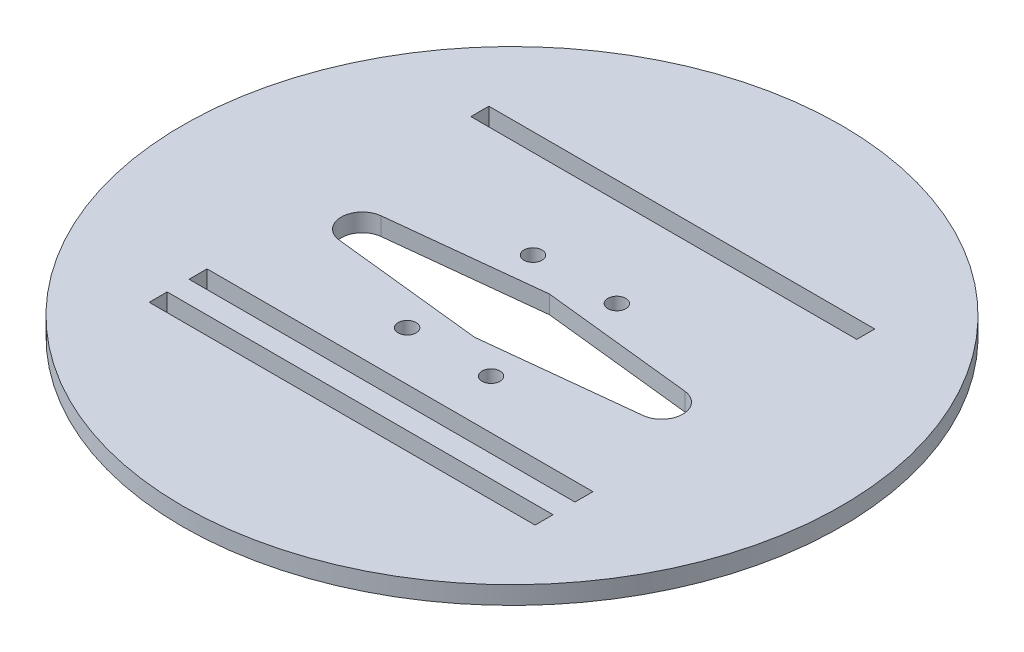
ISO-10303-21;
HEADER;
FILE_DESCRIPTION(('STEP AP214'),'2;1');
FILE_NAME('part.step','',(''),(''),'','','');
FILE_SCHEMA(('AUTOMOTIVE_DESIGN { 1 0 10303 214 1 1 1 1 }'));
ENDSEC;
DATA;
#1=APPLICATION_CONTEXT('core data for automotive mechanical design processes');
#2=APPLICATION_PROTOCOL_DEFINITION('international standard','automotive_design',2000,#1);
#3=PRODUCT_CONTEXT('',#1,'mechanical');
#4=PRODUCT('Part','Part','',(#3));
#5=PRODUCT_RELATED_PRODUCT_CATEGORY('part','',(#4));
#6=PRODUCT_DEFINITION_FORMATION('','',#4);
#7=PRODUCT_DEFINITION_CONTEXT('part definition',#1,'design');
#8=PRODUCT_DEFINITION('design','',#6,#7);
#9=PRODUCT_DEFINITION_SHAPE('','',#8);
#10=(LENGTH_UNIT() NAMED_UNIT(*) SI_UNIT(.MILLI.,.METRE.));
#11=(NAMED_UNIT(*) PLANE_ANGLE_UNIT() SI_UNIT($,.RADIAN.));
#12=(NAMED_UNIT(*) SI_UNIT($,.STERADIAN.) SOLID_ANGLE_UNIT());
#13=UNCERTAINTY_MEASURE_WITH_UNIT(LENGTH_MEASURE(1.E-05),#10,'distance_accuracy_value','');
#14=(GEOMETRIC_REPRESENTATION_CONTEXT(3) GLOBAL_UNCERTAINTY_ASSIGNED_CONTEXT((#13)) GLOBAL_UNIT_ASSIGNED_CONTEXT((#10,
#11,#12)) REPRESENTATION_CONTEXT('',''));
#15=CARTESIAN_POINT('',(0.,0.,0.));
#16=DIRECTION('',(0.,0.,1.));
#17=DIRECTION('',(1.,0.,0.));
#18=AXIS2_PLACEMENT_3D('',#15,#16,#17);
#19=CARTESIAN_POINT('',(0.,3.,0.));
#20=DIRECTION('',(0.,-1.,0.));
#21=DIRECTION('',(0.,0.,-1.));
#22=AXIS2_PLACEMENT_3D('',#19,#20,#21);
#23=CYLINDRICAL_SURFACE('',#22,55.);
#24=CARTESIAN_POINT('',(0.,3.,0.));
#25=DIRECTION('',(0.,1.,0.));
#26=DIRECTION('',(0.,0.,1.));
#27=AXIS2_PLACEMENT_3D('',#24,#25,#26);
#28=CIRCLE('',#27,55.);
#29=CARTESIAN_POINT('',(0.,3.,55.));
#30=VERTEX_POINT('',#29);
#31=EDGE_CURVE('E11',#30,#30,#28,.T.);
#32=ORIENTED_EDGE('',*,*,#31,.F.);
#33=EDGE_LOOP('',(#32));
#34=FACE_BOUND('',#33,.T.);
#35=CARTESIAN_POINT('',(0.,0.,0.));
#36=DIRECTION('',(0.,1.,0.));
#37=DIRECTION('',(0.,0.,1.));
#38=AXIS2_PLACEMENT_3D('',#35,#36,#37);
#39=CIRCLE('',#38,55.);
#40=CARTESIAN_POINT('',(0.,0.,55.));
#41=VERTEX_POINT('',#40);
#42=EDGE_CURVE('E48',#41,#41,#39,.T.);
#43=ORIENTED_EDGE('',*,*,#42,.T.);
#44=EDGE_LOOP('',(#43));
#45=FACE_BOUND('',#44,.T.);
#46=ADVANCED_FACE('F45',(#34,#45),#23,.T.);
#47=CARTESIAN_POINT('',(0.,3.,0.));
#48=DIRECTION('',(0.,1.,0.));
#49=DIRECTION('',(0.,0.,1.));
#50=AXIS2_PLACEMENT_3D('',#47,#48,#49);
#51=PLANE('',#50);
#52=CARTESIAN_POINT('',(7.,3.,10.5));
#53=DIRECTION('',(0.,1.,0.));
#54=DIRECTION('',(0.,0.,1.));
#55=AXIS2_PLACEMENT_3D('',#52,#53,#54);
#56=CIRCLE('',#55,1.5);
#57=CARTESIAN_POINT('',(7.,3.,12.));
#58=VERTEX_POINT('',#57);
#59=EDGE_CURVE('E615',#58,#58,#56,.T.);
#60=ORIENTED_EDGE('',*,*,#59,.F.);
#61=EDGE_LOOP('',(#60));
#62=FACE_BOUND('',#61,.T.);
#63=CARTESIAN_POINT('',(-7.,3.,10.5));
#64=DIRECTION('',(0.,1.,0.));
#65=DIRECTION('',(0.,0.,1.));
#66=AXIS2_PLACEMENT_3D('',#63,#64,#65);
#67=CIRCLE('',#66,1.5);
#68=CARTESIAN_POINT('',(-7.,3.,12.));
#69=VERTEX_POINT('',#68);
#70=EDGE_CURVE('E230',#69,#69,#67,.T.);
#71=ORIENTED_EDGE('',*,*,#70,.F.);
#72=EDGE_LOOP('',(#71));
#73=FACE_BOUND('',#72,.T.);
#74=DIRECTION('',(0.,0.,1.));
#75=VECTOR('',#74,1.);
#76=CARTESIAN_POINT('',(-32.2,3.,25.35));
#77=LINE('',#76,#75);
#78=CARTESIAN_POINT('',(-32.2,3.,25.35));
#79=VERTEX_POINT('',#78);
#80=CARTESIAN_POINT('',(-32.2,3.,28.35));
#81=VERTEX_POINT('',#80);
#82=EDGE_CURVE('E60',#79,#81,#77,.T.);
#83=ORIENTED_EDGE('',*,*,#82,.F.);
#84=DIRECTION('',(-1.,0.,0.));
#85=VECTOR('',#84,1.);
#86=CARTESIAN_POINT('',(-32.2,3.,25.35));
#87=LINE('',#86,#85);
#88=CARTESIAN_POINT('',(32.2,3.,25.35));
#89=VERTEX_POINT('',#88);
#90=EDGE_CURVE('E231',#89,#79,#87,.T.);
#91=ORIENTED_EDGE('',*,*,#90,.F.);
#92=DIRECTION('',(0.,0.,-1.));
#93=VECTOR('',#92,1.);
#94=CARTESIAN_POINT('',(32.2,3.,25.35));
#95=LINE('',#94,#93);
#96=CARTESIAN_POINT('',(32.2,3.,28.35));
#97=VERTEX_POINT('',#96);
#98=EDGE_CURVE('E235',#97,#89,#95,.T.);
#99=ORIENTED_EDGE('',*,*,#98,.F.);
#100=DIRECTION('',(1.,0.,0.));
#101=VECTOR('',#100,1.);
#102=CARTESIAN_POINT('',(-32.2,3.,28.35));
#103=LINE('',#102,#101);
#104=EDGE_CURVE('E240',#81,#97,#103,.T.);
#105=ORIENTED_EDGE('',*,*,#104,.F.);
#106=EDGE_LOOP('',(#83,#91,#99,#105));
#107=FACE_BOUND('',#106,.T.);
#108=DIRECTION('',(0.,0.,1.));
#109=VECTOR('',#108,1.);
#110=CARTESIAN_POINT('',(-32.2,3.,-25.34));
#111=LINE('',#110,#109);
#112=CARTESIAN_POINT('',(-32.2,3.,-28.34));
#113=VERTEX_POINT('',#112);
#114=CARTESIAN_POINT('',(-32.2,3.,-25.34));
#115=VERTEX_POINT('',#114);
#116=EDGE_CURVE('E68',#113,#115,#111,.T.);
#117=ORIENTED_EDGE('',*,*,#116,.F.);
#118=DIRECTION('',(-1.,0.,0.));
#119=VECTOR('',#118,1.);
#120=CARTESIAN_POINT('',(-32.2,3.,-28.34));
#121=LINE('',#120,#119);
#122=CARTESIAN_POINT('',(32.2,3.,-28.34));
#123=VERTEX_POINT('',#122);
#124=EDGE_CURVE('E180',#123,#113,#121,.T.);
#125=ORIENTED_EDGE('',*,*,#124,.F.);
#126=DIRECTION('',(0.,0.,-1.));
#127=VECTOR('',#126,1.);
#128=CARTESIAN_POINT('',(32.2,3.,-25.34));
#129=LINE('',#128,#127);
#130=CARTESIAN_POINT('',(32.2,3.,-25.34));
#131=VERTEX_POINT('',#130);
#132=EDGE_CURVE('E186',#131,#123,#129,.T.);
#133=ORIENTED_EDGE('',*,*,#132,.F.);
#134=DIRECTION('',(1.,0.,0.));
#135=VECTOR('',#134,1.);
#136=CARTESIAN_POINT('',(-32.2,3.,-25.34));
#137=LINE('',#136,#135);
#138=EDGE_CURVE('E192',#115,#131,#137,.T.);
#139=ORIENTED_EDGE('',*,*,#138,.F.);
#140=EDGE_LOOP('',(#117,#125,#133,#139));
#141=FACE_BOUND('',#140,.T.);
#142=CARTESIAN_POINT('',(-7.,3.,-10.5));
#143=DIRECTION('',(0.,1.,0.));
#144=DIRECTION('',(0.,0.,1.));
#145=AXIS2_PLACEMENT_3D('',#142,#143,#144);
#146=CIRCLE('',#145,1.5);
#147=CARTESIAN_POINT('',(-7.,3.,-9.));
#148=VERTEX_POINT('',#147);
#149=EDGE_CURVE('E623',#148,#148,#146,.T.);
#150=ORIENTED_EDGE('',*,*,#149,.F.);
#151=EDGE_LOOP('',(#150));
#152=FACE_BOUND('',#151,.T.);
#153=CARTESIAN_POINT('',(7.,3.,-10.5));
#154=DIRECTION('',(0.,1.,0.));
#155=DIRECTION('',(0.,0.,1.));
#156=AXIS2_PLACEMENT_3D('',#153,#154,#155);
#157=CIRCLE('',#156,1.5);
#158=CARTESIAN_POINT('',(7.,3.,-9.));
#159=VERTEX_POINT('',#158);
#160=EDGE_CURVE('E656',#159,#159,#157,.T.);
#161=ORIENTED_EDGE('',*,*,#160,.F.);
#162=EDGE_LOOP('',(#161));
#163=FACE_BOUND('',#162,.T.);
#164=DIRECTION('',(0.,0.,-1.));
#165=VECTOR('',#164,1.);
#166=CARTESIAN_POINT('',(32.2,3.,18.69));
#167=LINE('',#166,#165);
#168=CARTESIAN_POINT('',(32.2,3.,21.69));
#169=VERTEX_POINT('',#168);
#170=CARTESIAN_POINT('',(32.2,3.,18.69));
#171=VERTEX_POINT('',#170);
#172=EDGE_CURVE('E194',#169,#171,#167,.T.);
#173=ORIENTED_EDGE('',*,*,#172,.F.);
#174=DIRECTION('',(1.,0.,0.));
#175=VECTOR('',#174,1.);
#176=CARTESIAN_POINT('',(32.2,3.,21.69));
#177=LINE('',#176,#175);
#178=CARTESIAN_POINT('',(-32.2,3.,21.69));
#179=VERTEX_POINT('',#178);
#180=EDGE_CURVE('E265',#179,#169,#177,.T.);
#181=ORIENTED_EDGE('',*,*,#180,.F.);
#182=DIRECTION('',(0.,0.,1.));
#183=VECTOR('',#182,1.);
#184=CARTESIAN_POINT('',(-32.2,3.,18.69));
#185=LINE('',#184,#183);
#186=CARTESIAN_POINT('',(-32.2,3.,18.69));
#187=VERTEX_POINT('',#186);
#188=EDGE_CURVE('E281',#187,#179,#185,.T.);
#189=ORIENTED_EDGE('',*,*,#188,.F.);
#190=DIRECTION('',(-1.,0.,0.));
#191=VECTOR('',#190,1.);
#192=CARTESIAN_POINT('',(32.2,3.,18.69));
#193=LINE('',#192,#191);
#194=EDGE_CURVE('E198',#171,#187,#193,.T.);
#195=ORIENTED_EDGE('',*,*,#194,.F.);
#196=EDGE_LOOP('',(#173,#181,#189,#195));
#197=FACE_BOUND('',#196,.T.);
#198=CARTESIAN_POINT('',(-24.9794804911817,3.,0.));
#199=DIRECTION('',(0.,1.,0.));
#200=DIRECTION('',(0.,0.,1.));
#201=AXIS2_PLACEMENT_3D('',#198,#199,#200);
#202=CIRCLE('',#201,3.52051950881834);
#203=CARTESIAN_POINT('',(-25.3590297132472,3.,-3.5));
#204=VERTEX_POINT('',#203);
#205=CARTESIAN_POINT('',(-25.3590297132472,3.,3.5));
#206=VERTEX_POINT('',#205);
#207=EDGE_CURVE('E291',#204,#206,#202,.T.);
#208=ORIENTED_EDGE('',*,*,#207,.F.);
#209=DIRECTION('',(-0.99417145430754,0.,0.107810572023485));
#210=VECTOR('',#209,1.);
#211=CARTESIAN_POINT('',(-25.3590297132472,3.,-3.5));
#212=LINE('',#211,#210);
#213=CARTESIAN_POINT('',(0.,3.,-6.25));
#214=VERTEX_POINT('',#213);
#215=EDGE_CURVE('E306',#214,#204,#212,.T.);
#216=ORIENTED_EDGE('',*,*,#215,.F.);
#217=DIRECTION('',(-0.99417145430754,0.,-0.107810572023485));
#218=VECTOR('',#217,1.);
#219=CARTESIAN_POINT('',(0.,3.,-6.25));
#220=LINE('',#219,#218);
#221=CARTESIAN_POINT('',(25.3590297132472,3.,-3.5));
#222=VERTEX_POINT('',#221);
#223=EDGE_CURVE('E341',#222,#214,#220,.T.);
#224=ORIENTED_EDGE('',*,*,#223,.F.);
#225=CARTESIAN_POINT('',(24.9794804911817,3.,0.));
#226=DIRECTION('',(0.,1.,0.));
#227=DIRECTION('',(0.,0.,1.));
#228=AXIS2_PLACEMENT_3D('',#225,#226,#227);
#229=CIRCLE('',#228,3.52051950881834);
#230=CARTESIAN_POINT('',(25.3590297132472,3.,3.5));
#231=VERTEX_POINT('',#230);
#232=EDGE_CURVE('E337',#231,#222,#229,.T.);
#233=ORIENTED_EDGE('',*,*,#232,.F.);
#234=DIRECTION('',(0.99417145430754,0.,-0.107810572023485));
#235=VECTOR('',#234,1.);
#236=CARTESIAN_POINT('',(25.3590297132472,3.,3.5));
#237=LINE('',#236,#235);
#238=CARTESIAN_POINT('',(0.,3.,6.25));
#239=VERTEX_POINT('',#238);
#240=EDGE_CURVE('E333',#239,#231,#237,.T.);
#241=ORIENTED_EDGE('',*,*,#240,.F.);
#242=DIRECTION('',(0.99417145430754,0.,0.107810572023485));
#243=VECTOR('',#242,1.);
#244=CARTESIAN_POINT('',(0.,3.,6.25));
#245=LINE('',#244,#243);
#246=EDGE_CURVE('E329',#206,#239,#245,.T.);
#247=ORIENTED_EDGE('',*,*,#246,.F.);
#248=EDGE_LOOP('',(#208,#216,#224,#233,#241,#247));
#249=FACE_BOUND('',#248,.T.);
#250=ORIENTED_EDGE('',*,*,#31,.T.);
#251=EDGE_LOOP('',(#250));
#252=FACE_BOUND('',#251,.T.);
#253=ADVANCED_FACE('F189',(#62,#73,#107,#141,#152,#163,#197,#249,#252),#51,.T.);
#254=CARTESIAN_POINT('',(0.,0.,0.));
#255=DIRECTION('',(0.,1.,0.));
#256=DIRECTION('',(0.,0.,1.));
#257=AXIS2_PLACEMENT_3D('',#254,#255,#256);
#258=PLANE('',#257);
#259=CARTESIAN_POINT('',(7.,0.,10.5));
#260=DIRECTION('',(0.,1.,0.));
#261=DIRECTION('',(0.,0.,1.));
#262=AXIS2_PLACEMENT_3D('',#259,#260,#261);
#263=CIRCLE('',#262,1.5);
#264=CARTESIAN_POINT('',(7.,0.,12.));
#265=VERTEX_POINT('',#264);
#266=EDGE_CURVE('E612',#265,#265,#263,.T.);
#267=ORIENTED_EDGE('',*,*,#266,.T.);
#268=EDGE_LOOP('',(#267));
#269=FACE_BOUND('',#268,.T.);
#270=CARTESIAN_POINT('',(-7.,0.,10.5));
#271=DIRECTION('',(0.,1.,0.));
#272=DIRECTION('',(0.,0.,1.));
#273=AXIS2_PLACEMENT_3D('',#270,#271,#272);
#274=CIRCLE('',#273,1.5);
#275=CARTESIAN_POINT('',(-7.,0.,12.));
#276=VERTEX_POINT('',#275);
#277=EDGE_CURVE('E617',#276,#276,#274,.T.);
#278=ORIENTED_EDGE('',*,*,#277,.T.);
#279=EDGE_LOOP('',(#278));
#280=FACE_BOUND('',#279,.T.);
#281=DIRECTION('',(-1.,0.,0.));
#282=VECTOR('',#281,1.);
#283=CARTESIAN_POINT('',(-32.2,0.,25.35));
#284=LINE('',#283,#282);
#285=CARTESIAN_POINT('',(32.2,0.,25.35));
#286=VERTEX_POINT('',#285);
#287=CARTESIAN_POINT('',(-32.2,0.,25.35));
#288=VERTEX_POINT('',#287);
#289=EDGE_CURVE('E220',#286,#288,#284,.T.);
#290=ORIENTED_EDGE('',*,*,#289,.T.);
#291=DIRECTION('',(0.,0.,1.));
#292=VECTOR('',#291,1.);
#293=CARTESIAN_POINT('',(-32.2,0.,25.35));
#294=LINE('',#293,#292);
#295=CARTESIAN_POINT('',(-32.2,0.,28.35));
#296=VERTEX_POINT('',#295);
#297=EDGE_CURVE('E236',#288,#296,#294,.T.);
#298=ORIENTED_EDGE('',*,*,#297,.T.);
#299=DIRECTION('',(1.,0.,0.));
#300=VECTOR('',#299,1.);
#301=CARTESIAN_POINT('',(-32.2,0.,28.35));
#302=LINE('',#301,#300);
#303=CARTESIAN_POINT('',(32.2,0.,28.35));
#304=VERTEX_POINT('',#303);
#305=EDGE_CURVE('E253',#296,#304,#302,.T.);
#306=ORIENTED_EDGE('',*,*,#305,.T.);
#307=DIRECTION('',(0.,0.,-1.));
#308=VECTOR('',#307,1.);
#309=CARTESIAN_POINT('',(32.2,0.,25.35));
#310=LINE('',#309,#308);
#311=EDGE_CURVE('E249',#304,#286,#310,.T.);
#312=ORIENTED_EDGE('',*,*,#311,.T.);
#313=EDGE_LOOP('',(#290,#298,#306,#312));
#314=FACE_BOUND('',#313,.T.);
#315=DIRECTION('',(-1.,0.,0.));
#316=VECTOR('',#315,1.);
#317=CARTESIAN_POINT('',(-32.2,0.,-28.34));
#318=LINE('',#317,#316);
#319=CARTESIAN_POINT('',(32.2,0.,-28.34));
#320=VERTEX_POINT('',#319);
#321=CARTESIAN_POINT('',(-32.2,0.,-28.34));
#322=VERTEX_POINT('',#321);
#323=EDGE_CURVE('E203',#320,#322,#318,.T.);
#324=ORIENTED_EDGE('',*,*,#323,.T.);
#325=DIRECTION('',(0.,0.,1.));
#326=VECTOR('',#325,1.);
#327=CARTESIAN_POINT('',(-32.2,0.,-25.34));
#328=LINE('',#327,#326);
#329=CARTESIAN_POINT('',(-32.2,0.,-25.34));
#330=VERTEX_POINT('',#329);
#331=EDGE_CURVE('E172',#322,#330,#328,.T.);
#332=ORIENTED_EDGE('',*,*,#331,.T.);
#333=DIRECTION('',(1.,0.,0.));
#334=VECTOR('',#333,1.);
#335=CARTESIAN_POINT('',(-32.2,0.,-25.34));
#336=LINE('',#335,#334);
#337=CARTESIAN_POINT('',(32.2,0.,-25.34));
#338=VERTEX_POINT('',#337);
#339=EDGE_CURVE('E211',#330,#338,#336,.T.);
#340=ORIENTED_EDGE('',*,*,#339,.T.);
#341=DIRECTION('',(0.,0.,-1.));
#342=VECTOR('',#341,1.);
#343=CARTESIAN_POINT('',(32.2,0.,-25.34));
#344=LINE('',#343,#342);
#345=EDGE_CURVE('E206',#338,#320,#344,.T.);
#346=ORIENTED_EDGE('',*,*,#345,.T.);
#347=EDGE_LOOP('',(#324,#332,#340,#346));
#348=FACE_BOUND('',#347,.T.);
#349=CARTESIAN_POINT('',(-7.,0.,-10.5));
#350=DIRECTION('',(0.,1.,0.));
#351=DIRECTION('',(0.,0.,1.));
#352=AXIS2_PLACEMENT_3D('',#349,#350,#351);
#353=CIRCLE('',#352,1.5);
#354=CARTESIAN_POINT('',(-7.,0.,-9.));
#355=VERTEX_POINT('',#354);
#356=EDGE_CURVE('E641',#355,#355,#353,.T.);
#357=ORIENTED_EDGE('',*,*,#356,.T.);
#358=EDGE_LOOP('',(#357));
#359=FACE_BOUND('',#358,.T.);
#360=CARTESIAN_POINT('',(7.,0.,-10.5));
#361=DIRECTION('',(0.,1.,0.));
#362=DIRECTION('',(0.,0.,1.));
#363=AXIS2_PLACEMENT_3D('',#360,#361,#362);
#364=CIRCLE('',#363,1.5);
#365=CARTESIAN_POINT('',(7.,0.,-9.));
#366=VERTEX_POINT('',#365);
#367=EDGE_CURVE('E645',#366,#366,#364,.T.);
#368=ORIENTED_EDGE('',*,*,#367,.T.);
#369=EDGE_LOOP('',(#368));
#370=FACE_BOUND('',#369,.T.);
#371=DIRECTION('',(1.,0.,0.));
#372=VECTOR('',#371,1.);
#373=CARTESIAN_POINT('',(32.2,0.,21.69));
#374=LINE('',#373,#372);
#375=CARTESIAN_POINT('',(-32.2,0.,21.69));
#376=VERTEX_POINT('',#375);
#377=CARTESIAN_POINT('',(32.2,0.,21.69));
#378=VERTEX_POINT('',#377);
#379=EDGE_CURVE('E273',#376,#378,#374,.T.);
#380=ORIENTED_EDGE('',*,*,#379,.T.);
#381=DIRECTION('',(0.,0.,-1.));
#382=VECTOR('',#381,1.);
#383=CARTESIAN_POINT('',(32.2,0.,18.69));
#384=LINE('',#383,#382);
#385=CARTESIAN_POINT('',(32.2,0.,18.69));
#386=VERTEX_POINT('',#385);
#387=EDGE_CURVE('E260',#378,#386,#384,.T.);
#388=ORIENTED_EDGE('',*,*,#387,.T.);
#389=DIRECTION('',(-1.,0.,0.));
#390=VECTOR('',#389,1.);
#391=CARTESIAN_POINT('',(32.2,0.,18.69));
#392=LINE('',#391,#390);
#393=CARTESIAN_POINT('',(-32.2,0.,18.69));
#394=VERTEX_POINT('',#393);
#395=EDGE_CURVE('E264',#386,#394,#392,.T.);
#396=ORIENTED_EDGE('',*,*,#395,.T.);
#397=DIRECTION('',(0.,0.,1.));
#398=VECTOR('',#397,1.);
#399=CARTESIAN_POINT('',(-32.2,0.,18.69));
#400=LINE('',#399,#398);
#401=EDGE_CURVE('E269',#394,#376,#400,.T.);
#402=ORIENTED_EDGE('',*,*,#401,.T.);
#403=EDGE_LOOP('',(#380,#388,#396,#402));
#404=FACE_BOUND('',#403,.T.);
#405=DIRECTION('',(-0.99417145430754,0.,0.107810572023485));
#406=VECTOR('',#405,1.);
#407=CARTESIAN_POINT('',(-25.3590297132472,0.,-3.5));
#408=LINE('',#407,#406);
#409=CARTESIAN_POINT('',(0.,0.,-6.25));
#410=VERTEX_POINT('',#409);
#411=CARTESIAN_POINT('',(-25.3590297132472,0.,-3.5));
#412=VERTEX_POINT('',#411);
#413=EDGE_CURVE('E322',#410,#412,#408,.T.);
#414=ORIENTED_EDGE('',*,*,#413,.T.);
#415=CARTESIAN_POINT('',(-24.9794804911817,0.,0.));
#416=DIRECTION('',(0.,1.,0.));
#417=DIRECTION('',(0.,0.,1.));
#418=AXIS2_PLACEMENT_3D('',#415,#416,#417);
#419=CIRCLE('',#418,3.52051950881834);
#420=CARTESIAN_POINT('',(-25.3590297132472,0.,3.5));
#421=VERTEX_POINT('',#420);
#422=EDGE_CURVE('E301',#412,#421,#419,.T.);
#423=ORIENTED_EDGE('',*,*,#422,.T.);
#424=DIRECTION('',(0.99417145430754,0.,0.107810572023485));
#425=VECTOR('',#424,1.);
#426=CARTESIAN_POINT('',(0.,0.,6.25));
#427=LINE('',#426,#425);
#428=CARTESIAN_POINT('',(0.,0.,6.25));
#429=VERTEX_POINT('',#428);
#430=EDGE_CURVE('E305',#421,#429,#427,.T.);
#431=ORIENTED_EDGE('',*,*,#430,.T.);
#432=DIRECTION('',(0.99417145430754,0.,-0.107810572023485));
#433=VECTOR('',#432,1.);
#434=CARTESIAN_POINT('',(25.3590297132472,0.,3.5));
#435=LINE('',#434,#433);
#436=CARTESIAN_POINT('',(25.3590297132472,0.,3.5));
#437=VERTEX_POINT('',#436);
#438=EDGE_CURVE('E310',#429,#437,#435,.T.);
#439=ORIENTED_EDGE('',*,*,#438,.T.);
#440=CARTESIAN_POINT('',(24.9794804911817,0.,0.));
#441=DIRECTION('',(0.,1.,0.));
#442=DIRECTION('',(0.,0.,1.));
#443=AXIS2_PLACEMENT_3D('',#440,#441,#442);
#444=CIRCLE('',#443,3.52051950881834);
#445=CARTESIAN_POINT('',(25.3590297132472,0.,-3.5));
#446=VERTEX_POINT('',#445);
#447=EDGE_CURVE('E314',#437,#446,#444,.T.);
#448=ORIENTED_EDGE('',*,*,#447,.T.);
#449=DIRECTION('',(-0.99417145430754,0.,-0.107810572023485));
#450=VECTOR('',#449,1.);
#451=CARTESIAN_POINT('',(0.,0.,-6.25));
#452=LINE('',#451,#450);
#453=EDGE_CURVE('E318',#446,#410,#452,.T.);
#454=ORIENTED_EDGE('',*,*,#453,.T.);
#455=EDGE_LOOP('',(#414,#423,#431,#439,#448,#454));
#456=FACE_BOUND('',#455,.T.);
#457=ORIENTED_EDGE('',*,*,#42,.F.);
#458=EDGE_LOOP('',(#457));
#459=FACE_BOUND('',#458,.T.);
#460=ADVANCED_FACE('F383',(#269,#280,#314,#348,#359,#370,#404,#456,#459),#258,.F.);
#461=CARTESIAN_POINT('',(-24.9794804911817,0.,0.));
#462=DIRECTION('',(0.,1.,0.));
#463=DIRECTION('',(0.,0.,1.));
#464=AXIS2_PLACEMENT_3D('',#461,#462,#463);
#465=CYLINDRICAL_SURFACE('',#464,3.52051950881834);
#466=ORIENTED_EDGE('',*,*,#207,.T.);
#467=DIRECTION('',(0.,1.,0.));
#468=VECTOR('',#467,1.);
#469=CARTESIAN_POINT('',(-25.3590297132472,0.,3.5));
#470=LINE('',#469,#468);
#471=EDGE_CURVE('E326',#421,#206,#470,.T.);
#472=ORIENTED_EDGE('',*,*,#471,.F.);
#473=ORIENTED_EDGE('',*,*,#422,.F.);
#474=DIRECTION('',(0.,1.,0.));
#475=VECTOR('',#474,1.);
#476=CARTESIAN_POINT('',(-25.3590297132472,0.,-3.5));
#477=LINE('',#476,#475);
#478=EDGE_CURVE('E348',#412,#204,#477,.T.);
#479=ORIENTED_EDGE('',*,*,#478,.T.);
#480=EDGE_LOOP('',(#466,#472,#473,#479));
#481=FACE_BOUND('',#480,.T.);
#482=ADVANCED_FACE('F386',(#481),#465,.F.);
#483=CARTESIAN_POINT('',(-25.3590297132472,0.,-3.5));
#484=DIRECTION('',(-0.107810572023485,0.,-0.99417145430754));
#485=DIRECTION('',(-0.99417145430754,0.,0.107810572023485));
#486=AXIS2_PLACEMENT_3D('',#483,#484,#485);
#487=PLANE('',#486);
#488=ORIENTED_EDGE('',*,*,#215,.T.);
#489=ORIENTED_EDGE('',*,*,#478,.F.);
#490=ORIENTED_EDGE('',*,*,#413,.F.);
#491=DIRECTION('',(0.,1.,0.));
#492=VECTOR('',#491,1.);
#493=CARTESIAN_POINT('',(0.,0.,-6.25));
#494=LINE('',#493,#492);
#495=EDGE_CURVE('E351',#410,#214,#494,.T.);
#496=ORIENTED_EDGE('',*,*,#495,.T.);
#497=EDGE_LOOP('',(#488,#489,#490,#496));
#498=FACE_BOUND('',#497,.T.);
#499=ADVANCED_FACE('F388',(#498),#487,.F.);
#500=CARTESIAN_POINT('',(0.,0.,-6.25));
#501=DIRECTION('',(0.107810572023485,0.,-0.99417145430754));
#502=DIRECTION('',(-0.99417145430754,0.,-0.107810572023485));
#503=AXIS2_PLACEMENT_3D('',#500,#501,#502);
#504=PLANE('',#503);
#505=ORIENTED_EDGE('',*,*,#223,.T.);
#506=ORIENTED_EDGE('',*,*,#495,.F.);
#507=ORIENTED_EDGE('',*,*,#453,.F.);
#508=DIRECTION('',(0.,1.,0.));
#509=VECTOR('',#508,1.);
#510=CARTESIAN_POINT('',(25.3590297132472,0.,-3.5));
#511=LINE('',#510,#509);
#512=EDGE_CURVE('E354',#446,#222,#511,.T.);
#513=ORIENTED_EDGE('',*,*,#512,.T.);
#514=EDGE_LOOP('',(#505,#506,#507,#513));
#515=FACE_BOUND('',#514,.T.);
#516=ADVANCED_FACE('F390',(#515),#504,.F.);
#517=CARTESIAN_POINT('',(24.9794804911817,0.,0.));
#518=DIRECTION('',(0.,1.,0.));
#519=DIRECTION('',(0.,0.,1.));
#520=AXIS2_PLACEMENT_3D('',#517,#518,#519);
#521=CYLINDRICAL_SURFACE('',#520,3.52051950881834);
#522=ORIENTED_EDGE('',*,*,#232,.T.);
#523=ORIENTED_EDGE('',*,*,#512,.F.);
#524=ORIENTED_EDGE('',*,*,#447,.F.);
#525=DIRECTION('',(0.,1.,0.));
#526=VECTOR('',#525,1.);
#527=CARTESIAN_POINT('',(25.3590297132472,0.,3.5));
#528=LINE('',#527,#526);
#529=EDGE_CURVE('E357',#437,#231,#528,.T.);
#530=ORIENTED_EDGE('',*,*,#529,.T.);
#531=EDGE_LOOP('',(#522,#523,#524,#530));
#532=FACE_BOUND('',#531,.T.);
#533=ADVANCED_FACE('F393',(#532),#521,.F.);
#534=CARTESIAN_POINT('',(25.3590297132472,0.,3.5));
#535=DIRECTION('',(0.107810572023485,0.,0.99417145430754));
#536=DIRECTION('',(0.99417145430754,0.,-0.107810572023485));
#537=AXIS2_PLACEMENT_3D('',#534,#535,#536);
#538=PLANE('',#537);
#539=ORIENTED_EDGE('',*,*,#240,.T.);
#540=ORIENTED_EDGE('',*,*,#529,.F.);
#541=ORIENTED_EDGE('',*,*,#438,.F.);
#542=DIRECTION('',(0.,1.,0.));
#543=VECTOR('',#542,1.);
#544=CARTESIAN_POINT('',(0.,0.,6.25));
#545=LINE('',#544,#543);
#546=EDGE_CURVE('E360',#429,#239,#545,.T.);
#547=ORIENTED_EDGE('',*,*,#546,.T.);
#548=EDGE_LOOP('',(#539,#540,#541,#547));
#549=FACE_BOUND('',#548,.T.);
#550=ADVANCED_FACE('F380',(#549),#538,.F.);
#551=CARTESIAN_POINT('',(0.,0.,6.25));
#552=DIRECTION('',(-0.107810572023485,0.,0.99417145430754));
#553=DIRECTION('',(0.99417145430754,0.,0.107810572023485));
#554=AXIS2_PLACEMENT_3D('',#551,#552,#553);
#555=PLANE('',#554);
#556=ORIENTED_EDGE('',*,*,#246,.T.);
#557=ORIENTED_EDGE('',*,*,#546,.F.);
#558=ORIENTED_EDGE('',*,*,#430,.F.);
#559=ORIENTED_EDGE('',*,*,#471,.T.);
#560=EDGE_LOOP('',(#556,#557,#558,#559));
#561=FACE_BOUND('',#560,.T.);
#562=ADVANCED_FACE('F368',(#561),#555,.F.);
#563=CARTESIAN_POINT('',(32.2,0.,18.69));
#564=DIRECTION('',(1.,0.,0.));
#565=DIRECTION('',(0.,0.,-1.));
#566=AXIS2_PLACEMENT_3D('',#563,#564,#565);
#567=PLANE('',#566);
#568=ORIENTED_EDGE('',*,*,#172,.T.);
#569=DIRECTION('',(0.,1.,0.));
#570=VECTOR('',#569,1.);
#571=CARTESIAN_POINT('',(32.2,0.,18.69));
#572=LINE('',#571,#570);
#573=EDGE_CURVE('E276',#386,#171,#572,.T.);
#574=ORIENTED_EDGE('',*,*,#573,.F.);
#575=ORIENTED_EDGE('',*,*,#387,.F.);
#576=DIRECTION('',(0.,1.,0.));
#577=VECTOR('',#576,1.);
#578=CARTESIAN_POINT('',(32.2,0.,21.69));
#579=LINE('',#578,#577);
#580=EDGE_CURVE('E288',#378,#169,#579,.T.);
#581=ORIENTED_EDGE('',*,*,#580,.T.);
#582=EDGE_LOOP('',(#568,#574,#575,#581));
#583=FACE_BOUND('',#582,.T.);
#584=ADVANCED_FACE('F425',(#583),#567,.F.);
#585=CARTESIAN_POINT('',(32.2,0.,21.69));
#586=DIRECTION('',(0.,0.,1.));
#587=DIRECTION('',(1.,0.,0.));
#588=AXIS2_PLACEMENT_3D('',#585,#586,#587);
#589=PLANE('',#588);
#590=ORIENTED_EDGE('',*,*,#180,.T.);
#591=ORIENTED_EDGE('',*,*,#580,.F.);
#592=ORIENTED_EDGE('',*,*,#379,.F.);
#593=DIRECTION('',(0.,1.,0.));
#594=VECTOR('',#593,1.);
#595=CARTESIAN_POINT('',(-32.2,0.,21.69));
#596=LINE('',#595,#594);
#597=EDGE_CURVE('E292',#376,#179,#596,.T.);
#598=ORIENTED_EDGE('',*,*,#597,.T.);
#599=EDGE_LOOP('',(#590,#591,#592,#598));
#600=FACE_BOUND('',#599,.T.);
#601=ADVANCED_FACE('F428',(#600),#589,.F.);
#602=CARTESIAN_POINT('',(-32.2,0.,18.69));
#603=DIRECTION('',(-1.,0.,0.));
#604=DIRECTION('',(0.,0.,1.));
#605=AXIS2_PLACEMENT_3D('',#602,#603,#604);
#606=PLANE('',#605);
#607=ORIENTED_EDGE('',*,*,#188,.T.);
#608=ORIENTED_EDGE('',*,*,#597,.F.);
#609=ORIENTED_EDGE('',*,*,#401,.F.);
#610=DIRECTION('',(0.,1.,0.));
#611=VECTOR('',#610,1.);
#612=CARTESIAN_POINT('',(-32.2,0.,18.69));
#613=LINE('',#612,#611);
#614=EDGE_CURVE('E295',#394,#187,#613,.T.);
#615=ORIENTED_EDGE('',*,*,#614,.T.);
#616=EDGE_LOOP('',(#607,#608,#609,#615));
#617=FACE_BOUND('',#616,.T.);
#618=ADVANCED_FACE('F434',(#617),#606,.F.);
#619=CARTESIAN_POINT('',(32.2,0.,18.69));
#620=DIRECTION('',(0.,0.,-1.));
#621=DIRECTION('',(-1.,0.,0.));
#622=AXIS2_PLACEMENT_3D('',#619,#620,#621);
#623=PLANE('',#622);
#624=ORIENTED_EDGE('',*,*,#194,.T.);
#625=ORIENTED_EDGE('',*,*,#614,.F.);
#626=ORIENTED_EDGE('',*,*,#395,.F.);
#627=ORIENTED_EDGE('',*,*,#573,.T.);
#628=EDGE_LOOP('',(#624,#625,#626,#627));
#629=FACE_BOUND('',#628,.T.);
#630=ADVANCED_FACE('F439',(#629),#623,.F.);
#631=CARTESIAN_POINT('',(7.,0.,-10.5));
#632=DIRECTION('',(0.,1.,0.));
#633=DIRECTION('',(0.,0.,1.));
#634=AXIS2_PLACEMENT_3D('',#631,#632,#633);
#635=CYLINDRICAL_SURFACE('',#634,1.5);
#636=ORIENTED_EDGE('',*,*,#367,.F.);
#637=EDGE_LOOP('',(#636));
#638=FACE_BOUND('',#637,.T.);
#639=ORIENTED_EDGE('',*,*,#160,.T.);
#640=EDGE_LOOP('',(#639));
#641=FACE_BOUND('',#640,.T.);
#642=ADVANCED_FACE('F493',(#638,#641),#635,.F.);
#643=CARTESIAN_POINT('',(-7.,0.,-10.5));
#644=DIRECTION('',(0.,1.,0.));
#645=DIRECTION('',(0.,0.,1.));
#646=AXIS2_PLACEMENT_3D('',#643,#644,#645);
#647=CYLINDRICAL_SURFACE('',#646,1.5);
#648=ORIENTED_EDGE('',*,*,#356,.F.);
#649=EDGE_LOOP('',(#648));
#650=FACE_BOUND('',#649,.T.);
#651=ORIENTED_EDGE('',*,*,#149,.T.);
#652=EDGE_LOOP('',(#651));
#653=FACE_BOUND('',#652,.T.);
#654=ADVANCED_FACE('F502',(#650,#653),#647,.F.);
#655=CARTESIAN_POINT('',(-32.2,0.,-25.34));
#656=DIRECTION('',(-1.,0.,0.));
#657=DIRECTION('',(0.,0.,1.));
#658=AXIS2_PLACEMENT_3D('',#655,#656,#657);
#659=PLANE('',#658);
#660=ORIENTED_EDGE('',*,*,#116,.T.);
#661=DIRECTION('',(0.,1.,0.));
#662=VECTOR('',#661,1.);
#663=CARTESIAN_POINT('',(-32.2,0.,-25.34));
#664=LINE('',#663,#662);
#665=EDGE_CURVE('E207',#330,#115,#664,.T.);
#666=ORIENTED_EDGE('',*,*,#665,.F.);
#667=ORIENTED_EDGE('',*,*,#331,.F.);
#668=DIRECTION('',(0.,1.,0.));
#669=VECTOR('',#668,1.);
#670=CARTESIAN_POINT('',(-32.2,0.,-28.34));
#671=LINE('',#670,#669);
#672=EDGE_CURVE('E168',#322,#113,#671,.T.);
#673=ORIENTED_EDGE('',*,*,#672,.T.);
#674=EDGE_LOOP('',(#660,#666,#667,#673));
#675=FACE_BOUND('',#674,.T.);
#676=ADVANCED_FACE('F170',(#675),#659,.F.);
#677=CARTESIAN_POINT('',(-32.2,0.,-28.34));
#678=DIRECTION('',(0.,0.,-1.));
#679=DIRECTION('',(-1.,0.,0.));
#680=AXIS2_PLACEMENT_3D('',#677,#678,#679);
#681=PLANE('',#680);
#682=ORIENTED_EDGE('',*,*,#124,.T.);
#683=ORIENTED_EDGE('',*,*,#672,.F.);
#684=ORIENTED_EDGE('',*,*,#323,.F.);
#685=DIRECTION('',(0.,1.,0.));
#686=VECTOR('',#685,1.);
#687=CARTESIAN_POINT('',(32.2,0.,-28.34));
#688=LINE('',#687,#686);
#689=EDGE_CURVE('E177',#320,#123,#688,.T.);
#690=ORIENTED_EDGE('',*,*,#689,.T.);
#691=EDGE_LOOP('',(#682,#683,#684,#690));
#692=FACE_BOUND('',#691,.T.);
#693=ADVANCED_FACE('F181',(#692),#681,.F.);
#694=CARTESIAN_POINT('',(32.2,0.,-25.34));
#695=DIRECTION('',(1.,0.,0.));
#696=DIRECTION('',(0.,0.,-1.));
#697=AXIS2_PLACEMENT_3D('',#694,#695,#696);
#698=PLANE('',#697);
#699=ORIENTED_EDGE('',*,*,#132,.T.);
#700=ORIENTED_EDGE('',*,*,#689,.F.);
#701=ORIENTED_EDGE('',*,*,#345,.F.);
#702=DIRECTION('',(0.,1.,0.));
#703=VECTOR('',#702,1.);
#704=CARTESIAN_POINT('',(32.2,0.,-25.34));
#705=LINE('',#704,#703);
#706=EDGE_CURVE('E629',#338,#131,#705,.T.);
#707=ORIENTED_EDGE('',*,*,#706,.T.);
#708=EDGE_LOOP('',(#699,#700,#701,#707));
#709=FACE_BOUND('',#708,.T.);
#710=ADVANCED_FACE('F529',(#709),#698,.F.);
#711=CARTESIAN_POINT('',(-32.2,0.,-25.34));
#712=DIRECTION('',(0.,0.,1.));
#713=DIRECTION('',(1.,0.,0.));
#714=AXIS2_PLACEMENT_3D('',#711,#712,#713);
#715=PLANE('',#714);
#716=ORIENTED_EDGE('',*,*,#138,.T.);
#717=ORIENTED_EDGE('',*,*,#706,.F.);
#718=ORIENTED_EDGE('',*,*,#339,.F.);
#719=ORIENTED_EDGE('',*,*,#665,.T.);
#720=EDGE_LOOP('',(#716,#717,#718,#719));
#721=FACE_BOUND('',#720,.T.);
#722=ADVANCED_FACE('F538',(#721),#715,.F.);
#723=CARTESIAN_POINT('',(-32.2,0.,25.35));
#724=DIRECTION('',(-1.,0.,0.));
#725=DIRECTION('',(0.,0.,1.));
#726=AXIS2_PLACEMENT_3D('',#723,#724,#725);
#727=PLANE('',#726);
#728=ORIENTED_EDGE('',*,*,#82,.T.);
#729=DIRECTION('',(0.,1.,0.));
#730=VECTOR('',#729,1.);
#731=CARTESIAN_POINT('',(-32.2,0.,28.35));
#732=LINE('',#731,#730);
#733=EDGE_CURVE('E217',#296,#81,#732,.T.);
#734=ORIENTED_EDGE('',*,*,#733,.F.);
#735=ORIENTED_EDGE('',*,*,#297,.F.);
#736=DIRECTION('',(0.,1.,0.));
#737=VECTOR('',#736,1.);
#738=CARTESIAN_POINT('',(-32.2,0.,25.35));
#739=LINE('',#738,#737);
#740=EDGE_CURVE('E227',#288,#79,#739,.T.);
#741=ORIENTED_EDGE('',*,*,#740,.T.);
#742=EDGE_LOOP('',(#728,#734,#735,#741));
#743=FACE_BOUND('',#742,.T.);
#744=ADVANCED_FACE('F548',(#743),#727,.F.);
#745=CARTESIAN_POINT('',(-32.2,0.,25.35));
#746=DIRECTION('',(0.,0.,-1.));
#747=DIRECTION('',(-1.,0.,0.));
#748=AXIS2_PLACEMENT_3D('',#745,#746,#747);
#749=PLANE('',#748);
#750=ORIENTED_EDGE('',*,*,#90,.T.);
#751=ORIENTED_EDGE('',*,*,#740,.F.);
#752=ORIENTED_EDGE('',*,*,#289,.F.);
#753=DIRECTION('',(0.,1.,0.));
#754=VECTOR('',#753,1.);
#755=CARTESIAN_POINT('',(32.2,0.,25.35));
#756=LINE('',#755,#754);
#757=EDGE_CURVE('E224',#286,#89,#756,.T.);
#758=ORIENTED_EDGE('',*,*,#757,.T.);
#759=EDGE_LOOP('',(#750,#751,#752,#758));
#760=FACE_BOUND('',#759,.T.);
#761=ADVANCED_FACE('F558',(#760),#749,.F.);
#762=CARTESIAN_POINT('',(32.2,0.,25.35));
#763=DIRECTION('',(1.,0.,0.));
#764=DIRECTION('',(0.,0.,-1.));
#765=AXIS2_PLACEMENT_3D('',#762,#763,#764);
#766=PLANE('',#765);
#767=ORIENTED_EDGE('',*,*,#98,.T.);
#768=ORIENTED_EDGE('',*,*,#757,.F.);
#769=ORIENTED_EDGE('',*,*,#311,.F.);
#770=DIRECTION('',(0.,1.,0.));
#771=VECTOR('',#770,1.);
#772=CARTESIAN_POINT('',(32.2,0.,28.35));
#773=LINE('',#772,#771);
#774=EDGE_CURVE('E221',#304,#97,#773,.T.);
#775=ORIENTED_EDGE('',*,*,#774,.T.);
#776=EDGE_LOOP('',(#767,#768,#769,#775));
#777=FACE_BOUND('',#776,.T.);
#778=ADVANCED_FACE('F567',(#777),#766,.F.);
#779=CARTESIAN_POINT('',(-32.2,0.,28.35));
#780=DIRECTION('',(0.,0.,1.));
#781=DIRECTION('',(1.,0.,0.));
#782=AXIS2_PLACEMENT_3D('',#779,#780,#781);
#783=PLANE('',#782);
#784=ORIENTED_EDGE('',*,*,#104,.T.);
#785=ORIENTED_EDGE('',*,*,#774,.F.);
#786=ORIENTED_EDGE('',*,*,#305,.F.);
#787=ORIENTED_EDGE('',*,*,#733,.T.);
#788=EDGE_LOOP('',(#784,#785,#786,#787));
#789=FACE_BOUND('',#788,.T.);
#790=ADVANCED_FACE('F577',(#789),#783,.F.);
#791=CARTESIAN_POINT('',(-7.,0.,10.5));
#792=DIRECTION('',(0.,1.,0.));
#793=DIRECTION('',(0.,0.,1.));
#794=AXIS2_PLACEMENT_3D('',#791,#792,#793);
#795=CYLINDRICAL_SURFACE('',#794,1.5);
#796=ORIENTED_EDGE('',*,*,#277,.F.);
#797=EDGE_LOOP('',(#796));
#798=FACE_BOUND('',#797,.T.);
#799=ORIENTED_EDGE('',*,*,#70,.T.);
#800=EDGE_LOOP('',(#799));
#801=FACE_BOUND('',#800,.T.);
#802=ADVANCED_FACE('F587',(#798,#801),#795,.F.);
#803=CARTESIAN_POINT('',(7.,0.,10.5));
#804=DIRECTION('',(0.,1.,0.));
#805=DIRECTION('',(0.,0.,1.));
#806=AXIS2_PLACEMENT_3D('',#803,#804,#805);
#807=CYLINDRICAL_SURFACE('',#806,1.5);
#808=ORIENTED_EDGE('',*,*,#266,.F.);
#809=EDGE_LOOP('',(#808));
#810=FACE_BOUND('',#809,.T.);
#811=ORIENTED_EDGE('',*,*,#59,.T.);
#812=EDGE_LOOP('',(#811));
#813=FACE_BOUND('',#812,.T.);
#814=ADVANCED_FACE('F597',(#810,#813),#807,.F.);
#815=CLOSED_SHELL('',(#46,#253,#460,#482,#499,#516,#533,#550,#562,#584,#601,#618,#630,#642,#654,
#676,#693,#710,#722,#744,#761,#778,#790,#802,#814));
#816=MANIFOLD_SOLID_BREP('B2',#815);
#817=ADVANCED_BREP_SHAPE_REPRESENTATION('',(#18,#816),#14);
#818=SHAPE_DEFINITION_REPRESENTATION(#9,#817);
ENDSEC;
END-ISO-10303-21;
